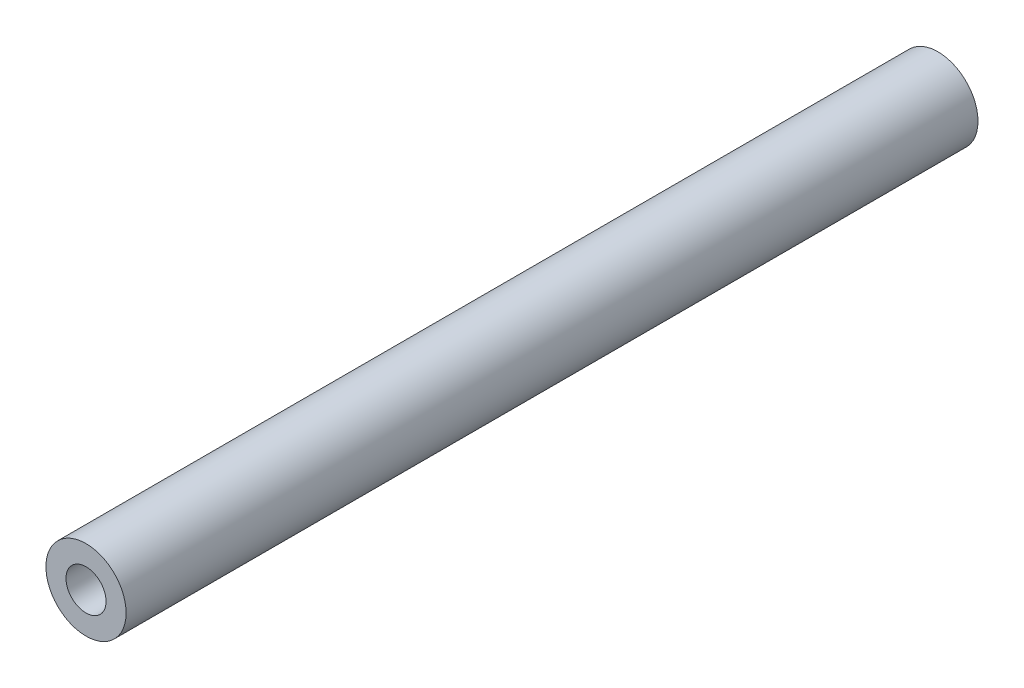
ISO-10303-21;
HEADER;
FILE_DESCRIPTION(('STEP AP214'),'2;1');
FILE_NAME('part.step','',(''),(''),'','','');
FILE_SCHEMA(('AUTOMOTIVE_DESIGN { 1 0 10303 214 1 1 1 1 }'));
ENDSEC;
DATA;
#1=APPLICATION_CONTEXT('core data for automotive mechanical design processes');
#2=APPLICATION_PROTOCOL_DEFINITION('international standard','automotive_design',2000,#1);
#3=PRODUCT_CONTEXT('',#1,'mechanical');
#4=PRODUCT('Part','Part','',(#3));
#5=PRODUCT_RELATED_PRODUCT_CATEGORY('part','',(#4));
#6=PRODUCT_DEFINITION_FORMATION('','',#4);
#7=PRODUCT_DEFINITION_CONTEXT('part definition',#1,'design');
#8=PRODUCT_DEFINITION('design','',#6,#7);
#9=PRODUCT_DEFINITION_SHAPE('','',#8);
#10=(LENGTH_UNIT() NAMED_UNIT(*) SI_UNIT(.MILLI.,.METRE.));
#11=(NAMED_UNIT(*) PLANE_ANGLE_UNIT() SI_UNIT($,.RADIAN.));
#12=(NAMED_UNIT(*) SI_UNIT($,.STERADIAN.) SOLID_ANGLE_UNIT());
#13=UNCERTAINTY_MEASURE_WITH_UNIT(LENGTH_MEASURE(1.E-05),#10,'distance_accuracy_value','');
#14=(GEOMETRIC_REPRESENTATION_CONTEXT(3) GLOBAL_UNCERTAINTY_ASSIGNED_CONTEXT((#13)) GLOBAL_UNIT_ASSIGNED_CONTEXT((#10,
#11,#12)) REPRESENTATION_CONTEXT('',''));
#15=CARTESIAN_POINT('',(0.,0.,0.));
#16=DIRECTION('',(0.,0.,1.));
#17=DIRECTION('',(1.,0.,0.));
#18=AXIS2_PLACEMENT_3D('',#15,#16,#17);
#19=CARTESIAN_POINT('',(0.,0.,1079.5));
#20=DIRECTION('',(0.,0.,1.));
#21=DIRECTION('',(1.,0.,0.));
#22=AXIS2_PLACEMENT_3D('',#19,#20,#21);
#23=PLANE('',#22);
#24=CARTESIAN_POINT('',(0.,0.,1079.5));
#25=DIRECTION('',(0.,0.,1.));
#26=DIRECTION('',(1.,0.,0.));
#27=AXIS2_PLACEMENT_3D('',#24,#25,#26);
#28=CIRCLE('',#27,101.6);
#29=CARTESIAN_POINT('',(101.6,0.,1079.5));
#30=VERTEX_POINT('',#29);
#31=EDGE_CURVE('E10',#30,#30,#28,.T.);
#32=ORIENTED_EDGE('',*,*,#31,.T.);
#33=EDGE_LOOP('',(#32));
#34=FACE_BOUND('',#33,.T.);
#35=CARTESIAN_POINT('',(0.,0.,1079.5));
#36=DIRECTION('',(0.,0.,1.));
#37=DIRECTION('',(1.,0.,0.));
#38=AXIS2_PLACEMENT_3D('',#35,#36,#37);
#39=CIRCLE('',#38,50.8);
#40=CARTESIAN_POINT('',(50.8,0.,1079.5));
#41=VERTEX_POINT('',#40);
#42=EDGE_CURVE('E46',#41,#41,#39,.T.);
#43=ORIENTED_EDGE('',*,*,#42,.F.);
#44=EDGE_LOOP('',(#43));
#45=FACE_BOUND('',#44,.T.);
#46=ADVANCED_FACE('F35',(#34,#45),#23,.T.);
#47=CARTESIAN_POINT('',(0.,0.,-1079.5));
#48=DIRECTION('',(0.,0.,1.));
#49=DIRECTION('',(1.,0.,0.));
#50=AXIS2_PLACEMENT_3D('',#47,#48,#49);
#51=PLANE('',#50);
#52=CARTESIAN_POINT('',(0.,0.,-1079.5));
#53=DIRECTION('',(0.,0.,1.));
#54=DIRECTION('',(1.,0.,0.));
#55=AXIS2_PLACEMENT_3D('',#52,#53,#54);
#56=CIRCLE('',#55,101.6);
#57=CARTESIAN_POINT('',(101.6,0.,-1079.5));
#58=VERTEX_POINT('',#57);
#59=EDGE_CURVE('E39',#58,#58,#56,.T.);
#60=ORIENTED_EDGE('',*,*,#59,.F.);
#61=EDGE_LOOP('',(#60));
#62=FACE_BOUND('',#61,.T.);
#63=CARTESIAN_POINT('',(0.,0.,-1079.5));
#64=DIRECTION('',(0.,0.,1.));
#65=DIRECTION('',(1.,0.,0.));
#66=AXIS2_PLACEMENT_3D('',#63,#64,#65);
#67=CIRCLE('',#66,50.8);
#68=CARTESIAN_POINT('',(50.8,0.,-1079.5));
#69=VERTEX_POINT('',#68);
#70=EDGE_CURVE('E48',#69,#69,#67,.T.);
#71=ORIENTED_EDGE('',*,*,#70,.T.);
#72=EDGE_LOOP('',(#71));
#73=FACE_BOUND('',#72,.T.);
#74=ADVANCED_FACE('F58',(#62,#73),#51,.F.);
#75=CARTESIAN_POINT('',(0.,0.,1079.5));
#76=DIRECTION('',(0.,0.,-1.));
#77=DIRECTION('',(-1.,0.,0.));
#78=AXIS2_PLACEMENT_3D('',#75,#76,#77);
#79=CYLINDRICAL_SURFACE('',#78,101.6);
#80=ORIENTED_EDGE('',*,*,#31,.F.);
#81=EDGE_LOOP('',(#80));
#82=FACE_BOUND('',#81,.T.);
#83=ORIENTED_EDGE('',*,*,#59,.T.);
#84=EDGE_LOOP('',(#83));
#85=FACE_BOUND('',#84,.T.);
#86=ADVANCED_FACE('F37',(#82,#85),#79,.T.);
#87=CARTESIAN_POINT('',(0.,0.,1079.5));
#88=DIRECTION('',(0.,0.,-1.));
#89=DIRECTION('',(-1.,0.,0.));
#90=AXIS2_PLACEMENT_3D('',#87,#88,#89);
#91=CYLINDRICAL_SURFACE('',#90,50.8);
#92=ORIENTED_EDGE('',*,*,#42,.T.);
#93=EDGE_LOOP('',(#92));
#94=FACE_BOUND('',#93,.T.);
#95=ORIENTED_EDGE('',*,*,#70,.F.);
#96=EDGE_LOOP('',(#95));
#97=FACE_BOUND('',#96,.T.);
#98=ADVANCED_FACE('F54',(#94,#97),#91,.F.);
#99=CLOSED_SHELL('',(#46,#74,#86,#98));
#100=MANIFOLD_SOLID_BREP('B2',#99);
#101=ADVANCED_BREP_SHAPE_REPRESENTATION('',(#18,#100),#14);
#102=SHAPE_DEFINITION_REPRESENTATION(#9,#101);
ENDSEC;
END-ISO-10303-21;
